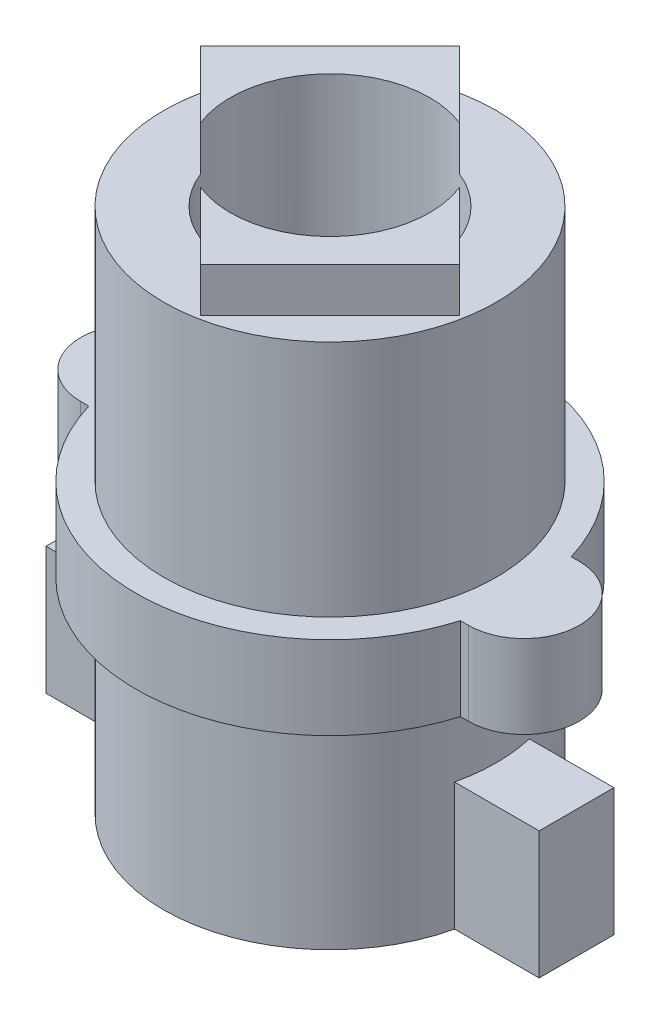
ISO-10303-21;
HEADER;
FILE_DESCRIPTION(('STEP AP214'),'2;1');
FILE_NAME('part.step','',(''),(''),'','','');
FILE_SCHEMA(('AUTOMOTIVE_DESIGN { 1 0 10303 214 1 1 1 1 }'));
ENDSEC;
DATA;
#1=APPLICATION_CONTEXT('core data for automotive mechanical design processes');
#2=APPLICATION_PROTOCOL_DEFINITION('international standard','automotive_design',2000,#1);
#3=PRODUCT_CONTEXT('',#1,'mechanical');
#4=PRODUCT('Part','Part','',(#3));
#5=PRODUCT_RELATED_PRODUCT_CATEGORY('part','',(#4));
#6=PRODUCT_DEFINITION_FORMATION('','',#4);
#7=PRODUCT_DEFINITION_CONTEXT('part definition',#1,'design');
#8=PRODUCT_DEFINITION('design','',#6,#7);
#9=PRODUCT_DEFINITION_SHAPE('','',#8);
#10=(LENGTH_UNIT() NAMED_UNIT(*) SI_UNIT(.MILLI.,.METRE.));
#11=(NAMED_UNIT(*) PLANE_ANGLE_UNIT() SI_UNIT($,.RADIAN.));
#12=(NAMED_UNIT(*) SI_UNIT($,.STERADIAN.) SOLID_ANGLE_UNIT());
#13=UNCERTAINTY_MEASURE_WITH_UNIT(LENGTH_MEASURE(1.E-05),#10,'distance_accuracy_value','');
#14=(GEOMETRIC_REPRESENTATION_CONTEXT(3) GLOBAL_UNCERTAINTY_ASSIGNED_CONTEXT((#13)) GLOBAL_UNIT_ASSIGNED_CONTEXT((#10,
#11,#12)) REPRESENTATION_CONTEXT('',''));
#15=CARTESIAN_POINT('',(0.,0.,0.));
#16=DIRECTION('',(0.,0.,1.));
#17=DIRECTION('',(1.,0.,0.));
#18=AXIS2_PLACEMENT_3D('',#15,#16,#17);
#19=CARTESIAN_POINT('',(0.,19.,0.));
#20=DIRECTION('',(0.,-1.,0.));
#21=DIRECTION('',(0.,0.,-1.));
#22=AXIS2_PLACEMENT_3D('',#19,#20,#21);
#23=PLANE('',#22);
#24=CARTESIAN_POINT('',(0.,19.,0.));
#25=DIRECTION('',(0.,-1.,0.));
#26=DIRECTION('',(0.,0.,-1.));
#27=AXIS2_PLACEMENT_3D('',#24,#25,#26);
#28=CIRCLE('',#27,6.);
#29=CARTESIAN_POINT('',(0.,19.,-6.));
#30=VERTEX_POINT('',#29);
#31=EDGE_CURVE('E246',#30,#30,#28,.T.);
#32=ORIENTED_EDGE('',*,*,#31,.F.);
#33=EDGE_LOOP('',(#32));
#34=FACE_BOUND('',#33,.T.);
#35=DIRECTION('',(-0.707106781186548,0.,-0.707106781186547));
#36=VECTOR('',#35,1.);
#37=CARTESIAN_POINT('',(-1.07798428791888,19.,-5.74771747087486));
#38=LINE('',#37,#36);
#39=CARTESIAN_POINT('',(1.32076699084699,19.,-3.34896619210899));
#40=VERTEX_POINT('',#39);
#41=CARTESIAN_POINT('',(-1.07798428791888,19.,-5.74771747087486));
#42=VERTEX_POINT('',#41);
#43=EDGE_CURVE('E238',#40,#42,#38,.T.);
#44=ORIENTED_EDGE('',*,*,#43,.F.);
#45=CARTESIAN_POINT('',(0.,19.,0.));
#46=DIRECTION('',(0.,-1.,0.));
#47=DIRECTION('',(0.,0.,-1.));
#48=AXIS2_PLACEMENT_3D('',#45,#46,#47);
#49=CIRCLE('',#48,3.6);
#50=CARTESIAN_POINT('',(3.34896619210901,19.,-1.32076699084695));
#51=VERTEX_POINT('',#50);
#52=EDGE_CURVE('E205',#40,#51,#49,.T.);
#53=ORIENTED_EDGE('',*,*,#52,.T.);
#54=DIRECTION('',(-0.707106781186548,0.,-0.707106781186547));
#55=VECTOR('',#54,1.);
#56=CARTESIAN_POINT('',(3.32304831818618,19.,-1.34668486476977));
#57=LINE('',#56,#55);
#58=CARTESIAN_POINT('',(5.74771747087485,19.,1.07798428791889));
#59=VERTEX_POINT('',#58);
#60=EDGE_CURVE('E62',#59,#51,#57,.T.);
#61=ORIENTED_EDGE('',*,*,#60,.F.);
#62=DIRECTION('',(0.707106781186547,0.,-0.707106781186548));
#63=VECTOR('',#62,1.);
#64=CARTESIAN_POINT('',(1.07798428791888,19.,5.74771747087486));
#65=LINE('',#64,#63);
#66=CARTESIAN_POINT('',(1.07798428791888,19.,5.74771747087486));
#67=VERTEX_POINT('',#66);
#68=EDGE_CURVE('E304',#67,#59,#65,.T.);
#69=ORIENTED_EDGE('',*,*,#68,.F.);
#70=DIRECTION('',(0.707106781186546,0.,0.707106781186549));
#71=VECTOR('',#70,1.);
#72=CARTESIAN_POINT('',(-1.34668486476979,19.,3.32304831818618));
#73=LINE('',#72,#71);
#74=CARTESIAN_POINT('',(-1.32076699084696,19.,3.348966192109));
#75=VERTEX_POINT('',#74);
#76=EDGE_CURVE('E325',#75,#67,#73,.T.);
#77=ORIENTED_EDGE('',*,*,#76,.F.);
#78=CARTESIAN_POINT('',(-3.348966192109,19.,1.32076699084696));
#79=VERTEX_POINT('',#78);
#80=EDGE_CURVE('E343',#75,#79,#49,.T.);
#81=ORIENTED_EDGE('',*,*,#80,.T.);
#82=DIRECTION('',(0.707106781186546,0.,0.707106781186549));
#83=VECTOR('',#82,1.);
#84=CARTESIAN_POINT('',(-5.74771747087485,19.,-1.0779842879189));
#85=LINE('',#84,#83);
#86=CARTESIAN_POINT('',(-5.74771747087485,19.,-1.0779842879189));
#87=VERTEX_POINT('',#86);
#88=EDGE_CURVE('E226',#87,#79,#85,.T.);
#89=ORIENTED_EDGE('',*,*,#88,.F.);
#90=DIRECTION('',(-0.707106781186549,0.,0.707106781186546));
#91=VECTOR('',#90,1.);
#92=CARTESIAN_POINT('',(-5.74771747087485,19.,-1.0779842879189));
#93=LINE('',#92,#91);
#94=EDGE_CURVE('E230',#42,#87,#93,.T.);
#95=ORIENTED_EDGE('',*,*,#94,.F.);
#96=EDGE_LOOP('',(#44,#53,#61,#69,#77,#81,#89,#95));
#97=FACE_BOUND('',#96,.T.);
#98=ADVANCED_FACE('F39',(#34,#97),#23,.F.);
#99=CARTESIAN_POINT('',(0.,19.,0.));
#100=DIRECTION('',(0.,-1.,0.));
#101=DIRECTION('',(0.,0.,-1.));
#102=AXIS2_PLACEMENT_3D('',#99,#100,#101);
#103=CYLINDRICAL_SURFACE('',#102,6.);
#104=CARTESIAN_POINT('',(0.,10.4,0.));
#105=DIRECTION('',(0.,1.,0.));
#106=DIRECTION('',(0.,0.,1.));
#107=AXIS2_PLACEMENT_3D('',#104,#105,#106);
#108=CIRCLE('',#107,6.);
#109=CARTESIAN_POINT('',(0.,10.4,6.));
#110=VERTEX_POINT('',#109);
#111=EDGE_CURVE('E11',#110,#110,#108,.F.);
#112=ORIENTED_EDGE('',*,*,#111,.F.);
#113=EDGE_LOOP('',(#112));
#114=FACE_BOUND('',#113,.T.);
#115=ORIENTED_EDGE('',*,*,#31,.T.);
#116=EDGE_LOOP('',(#115));
#117=FACE_BOUND('',#116,.T.);
#118=ADVANCED_FACE('F451',(#114,#117),#103,.T.);
#119=CARTESIAN_POINT('',(-1.07798428791888,20.6,-5.74771747087486));
#120=DIRECTION('',(-0.707106781186547,0.,0.707106781186548));
#121=DIRECTION('',(0.707106781186548,0.,0.707106781186547));
#122=AXIS2_PLACEMENT_3D('',#119,#120,#121);
#123=PLANE('',#122);
#124=DIRECTION('',(-0.707106781186548,0.,-0.707106781186547));
#125=VECTOR('',#124,1.);
#126=CARTESIAN_POINT('',(-1.07798428791888,20.6,-5.74771747087486));
#127=LINE('',#126,#125);
#128=CARTESIAN_POINT('',(1.32076699084699,20.6,-3.34896619210899));
#129=VERTEX_POINT('',#128);
#130=CARTESIAN_POINT('',(-1.07798428791888,20.6,-5.74771747087486));
#131=VERTEX_POINT('',#130);
#132=EDGE_CURVE('E214',#129,#131,#127,.T.);
#133=ORIENTED_EDGE('',*,*,#132,.F.);
#134=DIRECTION('',(0.,-1.,0.));
#135=VECTOR('',#134,1.);
#136=CARTESIAN_POINT('',(1.32076699084699,20.6,-3.34896619210899));
#137=LINE('',#136,#135);
#138=EDGE_CURVE('E200',#129,#40,#137,.T.);
#139=ORIENTED_EDGE('',*,*,#138,.T.);
#140=ORIENTED_EDGE('',*,*,#43,.T.);
#141=DIRECTION('',(0.,-1.,0.));
#142=VECTOR('',#141,1.);
#143=CARTESIAN_POINT('',(-1.07798428791888,20.6,-5.74771747087486));
#144=LINE('',#143,#142);
#145=EDGE_CURVE('E223',#131,#42,#144,.T.);
#146=ORIENTED_EDGE('',*,*,#145,.F.);
#147=EDGE_LOOP('',(#133,#139,#140,#146));
#148=FACE_BOUND('',#147,.T.);
#149=ADVANCED_FACE('F221',(#148),#123,.F.);
#150=CARTESIAN_POINT('',(-5.74771747087485,20.6,-1.0779842879189));
#151=DIRECTION('',(0.707106781186546,0.,0.707106781186549));
#152=DIRECTION('',(0.707106781186549,0.,-0.707106781186546));
#153=AXIS2_PLACEMENT_3D('',#150,#151,#152);
#154=PLANE('',#153);
#155=ORIENTED_EDGE('',*,*,#94,.T.);
#156=DIRECTION('',(0.,-1.,0.));
#157=VECTOR('',#156,1.);
#158=CARTESIAN_POINT('',(-5.74771747087485,20.6,-1.0779842879189));
#159=LINE('',#158,#157);
#160=CARTESIAN_POINT('',(-5.74771747087485,20.6,-1.0779842879189));
#161=VERTEX_POINT('',#160);
#162=EDGE_CURVE('E237',#161,#87,#159,.T.);
#163=ORIENTED_EDGE('',*,*,#162,.F.);
#164=DIRECTION('',(-0.707106781186549,0.,0.707106781186546));
#165=VECTOR('',#164,1.);
#166=CARTESIAN_POINT('',(-5.74771747087485,20.6,-1.0779842879189));
#167=LINE('',#166,#165);
#168=EDGE_CURVE('E225',#131,#161,#167,.T.);
#169=ORIENTED_EDGE('',*,*,#168,.F.);
#170=ORIENTED_EDGE('',*,*,#145,.T.);
#171=EDGE_LOOP('',(#155,#163,#169,#170));
#172=FACE_BOUND('',#171,.T.);
#173=ADVANCED_FACE('F569',(#172),#154,.F.);
#174=CARTESIAN_POINT('',(-5.74771747087485,20.6,-1.0779842879189));
#175=DIRECTION('',(0.707106781186549,0.,-0.707106781186546));
#176=DIRECTION('',(-0.707106781186546,0.,-0.707106781186549));
#177=AXIS2_PLACEMENT_3D('',#174,#175,#176);
#178=PLANE('',#177);
#179=ORIENTED_EDGE('',*,*,#88,.T.);
#180=DIRECTION('',(0.,-1.,0.));
#181=VECTOR('',#180,1.);
#182=CARTESIAN_POINT('',(-3.348966192109,20.6,1.32076699084696));
#183=LINE('',#182,#181);
#184=CARTESIAN_POINT('',(-3.348966192109,20.6,1.32076699084696));
#185=VERTEX_POINT('',#184);
#186=EDGE_CURVE('E348',#79,#185,#183,.F.);
#187=ORIENTED_EDGE('',*,*,#186,.T.);
#188=DIRECTION('',(0.707106781186546,0.,0.707106781186549));
#189=VECTOR('',#188,1.);
#190=CARTESIAN_POINT('',(-5.74771747087485,20.6,-1.0779842879189));
#191=LINE('',#190,#189);
#192=EDGE_CURVE('E217',#161,#185,#191,.T.);
#193=ORIENTED_EDGE('',*,*,#192,.F.);
#194=ORIENTED_EDGE('',*,*,#162,.T.);
#195=EDGE_LOOP('',(#179,#187,#193,#194));
#196=FACE_BOUND('',#195,.T.);
#197=ADVANCED_FACE('F575',(#196),#178,.F.);
#198=CARTESIAN_POINT('',(0.,20.6,0.));
#199=DIRECTION('',(0.,-1.,0.));
#200=DIRECTION('',(0.,0.,-1.));
#201=AXIS2_PLACEMENT_3D('',#198,#199,#200);
#202=PLANE('',#201);
#203=ORIENTED_EDGE('',*,*,#192,.T.);
#204=CARTESIAN_POINT('',(0.,20.6,0.));
#205=DIRECTION('',(0.,-1.,0.));
#206=DIRECTION('',(0.,0.,-1.));
#207=AXIS2_PLACEMENT_3D('',#204,#205,#206);
#208=CIRCLE('',#207,3.6);
#209=EDGE_CURVE('E203',#185,#129,#208,.T.);
#210=ORIENTED_EDGE('',*,*,#209,.T.);
#211=ORIENTED_EDGE('',*,*,#132,.T.);
#212=ORIENTED_EDGE('',*,*,#168,.T.);
#213=EDGE_LOOP('',(#203,#210,#211,#212));
#214=FACE_BOUND('',#213,.T.);
#215=ADVANCED_FACE('F213',(#214),#202,.F.);
#216=CARTESIAN_POINT('',(1.07798428791888,20.6,5.74771747087486));
#217=DIRECTION('',(-0.707106781186548,0.,-0.707106781186547));
#218=DIRECTION('',(-0.707106781186547,0.,0.707106781186548));
#219=AXIS2_PLACEMENT_3D('',#216,#217,#218);
#220=PLANE('',#219);
#221=ORIENTED_EDGE('',*,*,#68,.T.);
#222=DIRECTION('',(0.,-1.,0.));
#223=VECTOR('',#222,1.);
#224=CARTESIAN_POINT('',(5.74771747087485,20.6,1.07798428791889));
#225=LINE('',#224,#223);
#226=CARTESIAN_POINT('',(5.74771747087485,20.6,1.07798428791889));
#227=VERTEX_POINT('',#226);
#228=EDGE_CURVE('E233',#227,#59,#225,.T.);
#229=ORIENTED_EDGE('',*,*,#228,.F.);
#230=DIRECTION('',(0.707106781186547,0.,-0.707106781186548));
#231=VECTOR('',#230,1.);
#232=CARTESIAN_POINT('',(1.07798428791888,20.6,5.74771747087486));
#233=LINE('',#232,#231);
#234=CARTESIAN_POINT('',(1.07798428791888,20.6,5.74771747087486));
#235=VERTEX_POINT('',#234);
#236=EDGE_CURVE('E321',#235,#227,#233,.T.);
#237=ORIENTED_EDGE('',*,*,#236,.F.);
#238=DIRECTION('',(0.,-1.,0.));
#239=VECTOR('',#238,1.);
#240=CARTESIAN_POINT('',(1.07798428791888,20.6,5.74771747087486));
#241=LINE('',#240,#239);
#242=EDGE_CURVE('E329',#235,#67,#241,.T.);
#243=ORIENTED_EDGE('',*,*,#242,.T.);
#244=EDGE_LOOP('',(#221,#229,#237,#243));
#245=FACE_BOUND('',#244,.T.);
#246=ADVANCED_FACE('F340',(#245),#220,.F.);
#247=CARTESIAN_POINT('',(3.32304831818618,20.6,-1.34668486476977));
#248=DIRECTION('',(-0.707106781186547,0.,0.707106781186548));
#249=DIRECTION('',(0.707106781186548,0.,0.707106781186547));
#250=AXIS2_PLACEMENT_3D('',#247,#248,#249);
#251=PLANE('',#250);
#252=ORIENTED_EDGE('',*,*,#60,.T.);
#253=DIRECTION('',(0.,-1.,0.));
#254=VECTOR('',#253,1.);
#255=CARTESIAN_POINT('',(3.34896619210901,20.6,-1.32076699084695));
#256=LINE('',#255,#254);
#257=CARTESIAN_POINT('',(3.348966192109,20.6,-1.32076699084695));
#258=VERTEX_POINT('',#257);
#259=EDGE_CURVE('E353',#51,#258,#256,.F.);
#260=ORIENTED_EDGE('',*,*,#259,.T.);
#261=DIRECTION('',(-0.707106781186548,0.,-0.707106781186547));
#262=VECTOR('',#261,1.);
#263=CARTESIAN_POINT('',(3.32304831818618,20.6,-1.34668486476977));
#264=LINE('',#263,#262);
#265=EDGE_CURVE('E324',#227,#258,#264,.T.);
#266=ORIENTED_EDGE('',*,*,#265,.F.);
#267=ORIENTED_EDGE('',*,*,#228,.T.);
#268=EDGE_LOOP('',(#252,#260,#266,#267));
#269=FACE_BOUND('',#268,.T.);
#270=ADVANCED_FACE('F338',(#269),#251,.F.);
#271=CARTESIAN_POINT('',(-1.34668486476979,20.6,3.32304831818618));
#272=DIRECTION('',(0.707106781186549,0.,-0.707106781186546));
#273=DIRECTION('',(-0.707106781186546,0.,-0.707106781186549));
#274=AXIS2_PLACEMENT_3D('',#271,#272,#273);
#275=PLANE('',#274);
#276=DIRECTION('',(0.707106781186546,0.,0.707106781186549));
#277=VECTOR('',#276,1.);
#278=CARTESIAN_POINT('',(-1.34668486476979,20.6,3.32304831818618));
#279=LINE('',#278,#277);
#280=CARTESIAN_POINT('',(-1.32076699084696,20.6,3.348966192109));
#281=VERTEX_POINT('',#280);
#282=EDGE_CURVE('E328',#281,#235,#279,.T.);
#283=ORIENTED_EDGE('',*,*,#282,.F.);
#284=DIRECTION('',(0.,-1.,0.));
#285=VECTOR('',#284,1.);
#286=CARTESIAN_POINT('',(-1.32076699084696,20.6,3.348966192109));
#287=LINE('',#286,#285);
#288=EDGE_CURVE('E54',#281,#75,#287,.T.);
#289=ORIENTED_EDGE('',*,*,#288,.T.);
#290=ORIENTED_EDGE('',*,*,#76,.T.);
#291=ORIENTED_EDGE('',*,*,#242,.F.);
#292=EDGE_LOOP('',(#283,#289,#290,#291));
#293=FACE_BOUND('',#292,.T.);
#294=ADVANCED_FACE('F346',(#293),#275,.F.);
#295=CARTESIAN_POINT('',(0.,20.6,0.));
#296=DIRECTION('',(0.,-1.,0.));
#297=DIRECTION('',(0.,0.,-1.));
#298=AXIS2_PLACEMENT_3D('',#295,#296,#297);
#299=PLANE('',#298);
#300=ORIENTED_EDGE('',*,*,#265,.T.);
#301=EDGE_CURVE('E218',#258,#281,#208,.T.);
#302=ORIENTED_EDGE('',*,*,#301,.T.);
#303=ORIENTED_EDGE('',*,*,#282,.T.);
#304=ORIENTED_EDGE('',*,*,#236,.T.);
#305=EDGE_LOOP('',(#300,#302,#303,#304));
#306=FACE_BOUND('',#305,.T.);
#307=ADVANCED_FACE('F607',(#306),#299,.F.);
#308=CARTESIAN_POINT('',(0.,10.4,2.));
#309=DIRECTION('',(0.,0.,-1.));
#310=DIRECTION('',(-1.,0.,0.));
#311=AXIS2_PLACEMENT_3D('',#308,#309,#310);
#312=PLANE('',#311);
#313=DIRECTION('',(1.,0.,0.));
#314=VECTOR('',#313,1.);
#315=CARTESIAN_POINT('',(0.,7.4,2.));
#316=LINE('',#315,#314);
#317=CARTESIAN_POINT('',(-7.,7.4,2.));
#318=VERTEX_POINT('',#317);
#319=CARTESIAN_POINT('',(-6.70820393249937,7.4,2.));
#320=VERTEX_POINT('',#319);
#321=EDGE_CURVE('E209',#318,#320,#316,.T.);
#322=ORIENTED_EDGE('',*,*,#321,.T.);
#323=DIRECTION('',(0.,-1.,0.));
#324=VECTOR('',#323,1.);
#325=CARTESIAN_POINT('',(-6.70820393249937,10.4,2.));
#326=LINE('',#325,#324);
#327=CARTESIAN_POINT('',(-6.70820393249937,10.4,2.));
#328=VERTEX_POINT('',#327);
#329=EDGE_CURVE('E305',#328,#320,#326,.T.);
#330=ORIENTED_EDGE('',*,*,#329,.F.);
#331=DIRECTION('',(1.,0.,0.));
#332=VECTOR('',#331,1.);
#333=CARTESIAN_POINT('',(0.,10.4,2.));
#334=LINE('',#333,#332);
#335=CARTESIAN_POINT('',(-7.,10.4,2.));
#336=VERTEX_POINT('',#335);
#337=EDGE_CURVE('E355',#336,#328,#334,.T.);
#338=ORIENTED_EDGE('',*,*,#337,.F.);
#339=DIRECTION('',(0.,-1.,0.));
#340=VECTOR('',#339,1.);
#341=CARTESIAN_POINT('',(-7.,10.4,2.));
#342=LINE('',#341,#340);
#343=EDGE_CURVE('E375',#336,#318,#342,.T.);
#344=ORIENTED_EDGE('',*,*,#343,.T.);
#345=EDGE_LOOP('',(#322,#330,#338,#344));
#346=FACE_BOUND('',#345,.T.);
#347=ADVANCED_FACE('F432',(#346),#312,.F.);
#348=CARTESIAN_POINT('',(0.,10.4,0.));
#349=DIRECTION('',(0.,-1.,0.));
#350=DIRECTION('',(0.,0.,-1.));
#351=AXIS2_PLACEMENT_3D('',#348,#349,#350);
#352=CYLINDRICAL_SURFACE('',#351,7.);
#353=CARTESIAN_POINT('',(0.,7.4,0.));
#354=DIRECTION('',(0.,1.,0.));
#355=DIRECTION('',(0.,0.,1.));
#356=AXIS2_PLACEMENT_3D('',#353,#354,#355);
#357=CIRCLE('',#356,7.);
#358=CARTESIAN_POINT('',(6.70820393249937,7.4,2.));
#359=VERTEX_POINT('',#358);
#360=EDGE_CURVE('E377',#320,#359,#357,.T.);
#361=ORIENTED_EDGE('',*,*,#360,.T.);
#362=DIRECTION('',(0.,-1.,0.));
#363=VECTOR('',#362,1.);
#364=CARTESIAN_POINT('',(6.70820393249937,10.4,2.));
#365=LINE('',#364,#363);
#366=CARTESIAN_POINT('',(6.70820393249937,10.4,2.));
#367=VERTEX_POINT('',#366);
#368=EDGE_CURVE('E311',#367,#359,#365,.T.);
#369=ORIENTED_EDGE('',*,*,#368,.F.);
#370=CARTESIAN_POINT('',(0.,10.4,0.));
#371=DIRECTION('',(0.,1.,0.));
#372=DIRECTION('',(0.,0.,1.));
#373=AXIS2_PLACEMENT_3D('',#370,#371,#372);
#374=CIRCLE('',#373,7.);
#375=EDGE_CURVE('E358',#328,#367,#374,.T.);
#376=ORIENTED_EDGE('',*,*,#375,.F.);
#377=ORIENTED_EDGE('',*,*,#329,.T.);
#378=EDGE_LOOP('',(#361,#369,#376,#377));
#379=FACE_BOUND('',#378,.T.);
#380=ADVANCED_FACE('F428',(#379),#352,.T.);
#381=CARTESIAN_POINT('',(0.,10.4,2.));
#382=DIRECTION('',(0.,0.,-1.));
#383=DIRECTION('',(-1.,0.,0.));
#384=AXIS2_PLACEMENT_3D('',#381,#382,#383);
#385=PLANE('',#384);
#386=DIRECTION('',(1.,0.,0.));
#387=VECTOR('',#386,1.);
#388=CARTESIAN_POINT('',(0.,7.4,2.));
#389=LINE('',#388,#387);
#390=CARTESIAN_POINT('',(7.,7.4,2.));
#391=VERTEX_POINT('',#390);
#392=EDGE_CURVE('E379',#359,#391,#389,.T.);
#393=ORIENTED_EDGE('',*,*,#392,.T.);
#394=DIRECTION('',(0.,-1.,0.));
#395=VECTOR('',#394,1.);
#396=CARTESIAN_POINT('',(7.,10.4,2.));
#397=LINE('',#396,#395);
#398=CARTESIAN_POINT('',(7.,10.4,2.));
#399=VERTEX_POINT('',#398);
#400=EDGE_CURVE('E317',#399,#391,#397,.T.);
#401=ORIENTED_EDGE('',*,*,#400,.F.);
#402=DIRECTION('',(1.,0.,0.));
#403=VECTOR('',#402,1.);
#404=CARTESIAN_POINT('',(0.,10.4,2.));
#405=LINE('',#404,#403);
#406=EDGE_CURVE('E361',#367,#399,#405,.T.);
#407=ORIENTED_EDGE('',*,*,#406,.F.);
#408=ORIENTED_EDGE('',*,*,#368,.T.);
#409=EDGE_LOOP('',(#393,#401,#407,#408));
#410=FACE_BOUND('',#409,.T.);
#411=ADVANCED_FACE('F427',(#410),#385,.F.);
#412=CARTESIAN_POINT('',(7.,10.4,0.));
#413=DIRECTION('',(0.,-1.,0.));
#414=DIRECTION('',(0.,0.,-1.));
#415=AXIS2_PLACEMENT_3D('',#412,#413,#414);
#416=CYLINDRICAL_SURFACE('',#415,2.);
#417=CARTESIAN_POINT('',(7.,7.4,0.));
#418=DIRECTION('',(0.,1.,0.));
#419=DIRECTION('',(0.,0.,1.));
#420=AXIS2_PLACEMENT_3D('',#417,#418,#419);
#421=CIRCLE('',#420,2.);
#422=CARTESIAN_POINT('',(7.,7.4,-2.));
#423=VERTEX_POINT('',#422);
#424=EDGE_CURVE('E381',#391,#423,#421,.T.);
#425=ORIENTED_EDGE('',*,*,#424,.T.);
#426=DIRECTION('',(0.,-1.,0.));
#427=VECTOR('',#426,1.);
#428=CARTESIAN_POINT('',(7.,10.4,-2.));
#429=LINE('',#428,#427);
#430=CARTESIAN_POINT('',(7.,10.4,-2.));
#431=VERTEX_POINT('',#430);
#432=EDGE_CURVE('E402',#431,#423,#429,.T.);
#433=ORIENTED_EDGE('',*,*,#432,.F.);
#434=CARTESIAN_POINT('',(7.,10.4,0.));
#435=DIRECTION('',(0.,1.,0.));
#436=DIRECTION('',(0.,0.,1.));
#437=AXIS2_PLACEMENT_3D('',#434,#435,#436);
#438=CIRCLE('',#437,2.);
#439=EDGE_CURVE('E363',#399,#431,#438,.T.);
#440=ORIENTED_EDGE('',*,*,#439,.F.);
#441=ORIENTED_EDGE('',*,*,#400,.T.);
#442=EDGE_LOOP('',(#425,#433,#440,#441));
#443=FACE_BOUND('',#442,.T.);
#444=ADVANCED_FACE('F408',(#443),#416,.T.);
#445=CARTESIAN_POINT('',(0.,10.4,-2.));
#446=DIRECTION('',(0.,0.,-1.));
#447=DIRECTION('',(-1.,0.,0.));
#448=AXIS2_PLACEMENT_3D('',#445,#446,#447);
#449=PLANE('',#448);
#450=DIRECTION('',(1.,0.,0.));
#451=VECTOR('',#450,1.);
#452=CARTESIAN_POINT('',(0.,7.4,-2.));
#453=LINE('',#452,#451);
#454=CARTESIAN_POINT('',(6.70820393249937,7.4,-2.));
#455=VERTEX_POINT('',#454);
#456=EDGE_CURVE('E384',#455,#423,#453,.T.);
#457=ORIENTED_EDGE('',*,*,#456,.F.);
#458=DIRECTION('',(0.,-1.,0.));
#459=VECTOR('',#458,1.);
#460=CARTESIAN_POINT('',(6.70820393249937,10.4,-2.));
#461=LINE('',#460,#459);
#462=CARTESIAN_POINT('',(6.70820393249937,10.4,-2.));
#463=VERTEX_POINT('',#462);
#464=EDGE_CURVE('E400',#463,#455,#461,.T.);
#465=ORIENTED_EDGE('',*,*,#464,.F.);
#466=DIRECTION('',(1.,0.,0.));
#467=VECTOR('',#466,1.);
#468=CARTESIAN_POINT('',(0.,10.4,-2.));
#469=LINE('',#468,#467);
#470=EDGE_CURVE('E365',#463,#431,#469,.T.);
#471=ORIENTED_EDGE('',*,*,#470,.T.);
#472=ORIENTED_EDGE('',*,*,#432,.T.);
#473=EDGE_LOOP('',(#457,#465,#471,#472));
#474=FACE_BOUND('',#473,.T.);
#475=ADVANCED_FACE('F419',(#474),#449,.T.);
#476=CARTESIAN_POINT('',(0.,10.4,0.));
#477=DIRECTION('',(0.,-1.,0.));
#478=DIRECTION('',(0.,0.,-1.));
#479=AXIS2_PLACEMENT_3D('',#476,#477,#478);
#480=CYLINDRICAL_SURFACE('',#479,7.);
#481=CARTESIAN_POINT('',(0.,7.4,0.));
#482=DIRECTION('',(0.,1.,0.));
#483=DIRECTION('',(0.,0.,1.));
#484=AXIS2_PLACEMENT_3D('',#481,#482,#483);
#485=CIRCLE('',#484,7.);
#486=CARTESIAN_POINT('',(-6.70820393249937,7.4,-2.));
#487=VERTEX_POINT('',#486);
#488=EDGE_CURVE('E387',#455,#487,#485,.T.);
#489=ORIENTED_EDGE('',*,*,#488,.T.);
#490=DIRECTION('',(0.,-1.,0.));
#491=VECTOR('',#490,1.);
#492=CARTESIAN_POINT('',(-6.70820393249937,10.4,-2.));
#493=LINE('',#492,#491);
#494=CARTESIAN_POINT('',(-6.70820393249937,10.4,-2.));
#495=VERTEX_POINT('',#494);
#496=EDGE_CURVE('E398',#495,#487,#493,.T.);
#497=ORIENTED_EDGE('',*,*,#496,.F.);
#498=CARTESIAN_POINT('',(0.,10.4,0.));
#499=DIRECTION('',(0.,1.,0.));
#500=DIRECTION('',(0.,0.,1.));
#501=AXIS2_PLACEMENT_3D('',#498,#499,#500);
#502=CIRCLE('',#501,7.);
#503=EDGE_CURVE('E368',#463,#495,#502,.T.);
#504=ORIENTED_EDGE('',*,*,#503,.F.);
#505=ORIENTED_EDGE('',*,*,#464,.T.);
#506=EDGE_LOOP('',(#489,#497,#504,#505));
#507=FACE_BOUND('',#506,.T.);
#508=ADVANCED_FACE('F441',(#507),#480,.T.);
#509=CARTESIAN_POINT('',(0.,10.4,-2.));
#510=DIRECTION('',(0.,0.,-1.));
#511=DIRECTION('',(-1.,0.,0.));
#512=AXIS2_PLACEMENT_3D('',#509,#510,#511);
#513=PLANE('',#512);
#514=DIRECTION('',(1.,0.,0.));
#515=VECTOR('',#514,1.);
#516=CARTESIAN_POINT('',(0.,7.4,-2.));
#517=LINE('',#516,#515);
#518=CARTESIAN_POINT('',(-7.,7.4,-2.));
#519=VERTEX_POINT('',#518);
#520=EDGE_CURVE('E390',#519,#487,#517,.T.);
#521=ORIENTED_EDGE('',*,*,#520,.F.);
#522=DIRECTION('',(0.,-1.,0.));
#523=VECTOR('',#522,1.);
#524=CARTESIAN_POINT('',(-7.,10.4,-2.));
#525=LINE('',#524,#523);
#526=CARTESIAN_POINT('',(-7.,10.4,-2.));
#527=VERTEX_POINT('',#526);
#528=EDGE_CURVE('E396',#527,#519,#525,.T.);
#529=ORIENTED_EDGE('',*,*,#528,.F.);
#530=DIRECTION('',(1.,0.,0.));
#531=VECTOR('',#530,1.);
#532=CARTESIAN_POINT('',(0.,10.4,-2.));
#533=LINE('',#532,#531);
#534=EDGE_CURVE('E370',#527,#495,#533,.T.);
#535=ORIENTED_EDGE('',*,*,#534,.T.);
#536=ORIENTED_EDGE('',*,*,#496,.T.);
#537=EDGE_LOOP('',(#521,#529,#535,#536));
#538=FACE_BOUND('',#537,.T.);
#539=ADVANCED_FACE('F439',(#538),#513,.T.);
#540=CARTESIAN_POINT('',(-7.,10.4,0.));
#541=DIRECTION('',(0.,-1.,0.));
#542=DIRECTION('',(0.,0.,-1.));
#543=AXIS2_PLACEMENT_3D('',#540,#541,#542);
#544=CYLINDRICAL_SURFACE('',#543,2.);
#545=CARTESIAN_POINT('',(-7.,7.4,0.));
#546=DIRECTION('',(0.,1.,0.));
#547=DIRECTION('',(0.,0.,1.));
#548=AXIS2_PLACEMENT_3D('',#545,#546,#547);
#549=CIRCLE('',#548,2.);
#550=EDGE_CURVE('E359',#519,#318,#549,.T.);
#551=ORIENTED_EDGE('',*,*,#550,.T.);
#552=ORIENTED_EDGE('',*,*,#343,.F.);
#553=CARTESIAN_POINT('',(-7.,10.4,0.));
#554=DIRECTION('',(0.,1.,0.));
#555=DIRECTION('',(0.,0.,1.));
#556=AXIS2_PLACEMENT_3D('',#553,#554,#555);
#557=CIRCLE('',#556,2.);
#558=EDGE_CURVE('E373',#527,#336,#557,.T.);
#559=ORIENTED_EDGE('',*,*,#558,.F.);
#560=ORIENTED_EDGE('',*,*,#528,.T.);
#561=EDGE_LOOP('',(#551,#552,#559,#560));
#562=FACE_BOUND('',#561,.T.);
#563=ADVANCED_FACE('F437',(#562),#544,.T.);
#564=CARTESIAN_POINT('',(0.,10.4,0.));
#565=DIRECTION('',(0.,1.,0.));
#566=DIRECTION('',(0.,0.,1.));
#567=AXIS2_PLACEMENT_3D('',#564,#565,#566);
#568=PLANE('',#567);
#569=ORIENTED_EDGE('',*,*,#111,.T.);
#570=EDGE_LOOP('',(#569));
#571=FACE_BOUND('',#570,.T.);
#572=ORIENTED_EDGE('',*,*,#337,.T.);
#573=ORIENTED_EDGE('',*,*,#375,.T.);
#574=ORIENTED_EDGE('',*,*,#406,.T.);
#575=ORIENTED_EDGE('',*,*,#439,.T.);
#576=ORIENTED_EDGE('',*,*,#470,.F.);
#577=ORIENTED_EDGE('',*,*,#503,.T.);
#578=ORIENTED_EDGE('',*,*,#534,.F.);
#579=ORIENTED_EDGE('',*,*,#558,.T.);
#580=EDGE_LOOP('',(#572,#573,#574,#575,#576,#577,#578,#579));
#581=FACE_BOUND('',#580,.T.);
#582=ADVANCED_FACE('F423',(#571,#581),#568,.T.);
#583=CARTESIAN_POINT('',(0.,7.4,0.));
#584=DIRECTION('',(0.,1.,0.));
#585=DIRECTION('',(0.,0.,1.));
#586=AXIS2_PLACEMENT_3D('',#583,#584,#585);
#587=PLANE('',#586);
#588=CARTESIAN_POINT('',(0.,7.4,0.));
#589=DIRECTION('',(0.,1.,0.));
#590=DIRECTION('',(0.,0.,1.));
#591=AXIS2_PLACEMENT_3D('',#588,#589,#590);
#592=CIRCLE('',#591,6.);
#593=CARTESIAN_POINT('',(0.,7.4,6.));
#594=VERTEX_POINT('',#593);
#595=EDGE_CURVE('E302',#594,#594,#592,.F.);
#596=ORIENTED_EDGE('',*,*,#595,.F.);
#597=EDGE_LOOP('',(#596));
#598=FACE_BOUND('',#597,.T.);
#599=ORIENTED_EDGE('',*,*,#321,.F.);
#600=ORIENTED_EDGE('',*,*,#550,.F.);
#601=ORIENTED_EDGE('',*,*,#520,.T.);
#602=ORIENTED_EDGE('',*,*,#488,.F.);
#603=ORIENTED_EDGE('',*,*,#456,.T.);
#604=ORIENTED_EDGE('',*,*,#424,.F.);
#605=ORIENTED_EDGE('',*,*,#392,.F.);
#606=ORIENTED_EDGE('',*,*,#360,.F.);
#607=EDGE_LOOP('',(#599,#600,#601,#602,#603,#604,#605,#606));
#608=FACE_BOUND('',#607,.T.);
#609=ADVANCED_FACE('F415',(#598,#608),#587,.F.);
#610=CARTESIAN_POINT('',(-8.9,4.6,-1.35));
#611=DIRECTION('',(1.,0.,0.));
#612=DIRECTION('',(0.,0.,-1.));
#613=AXIS2_PLACEMENT_3D('',#610,#611,#612);
#614=PLANE('',#613);
#615=DIRECTION('',(0.,0.,1.));
#616=VECTOR('',#615,1.);
#617=CARTESIAN_POINT('',(-8.9,0.,-1.35));
#618=LINE('',#617,#616);
#619=CARTESIAN_POINT('',(-8.9,0.,-1.35));
#620=VERTEX_POINT('',#619);
#621=CARTESIAN_POINT('',(-8.9,0.,1.35));
#622=VERTEX_POINT('',#621);
#623=EDGE_CURVE('E267',#620,#622,#618,.T.);
#624=ORIENTED_EDGE('',*,*,#623,.T.);
#625=DIRECTION('',(0.,-1.,0.));
#626=VECTOR('',#625,1.);
#627=CARTESIAN_POINT('',(-8.9,4.6,1.35));
#628=LINE('',#627,#626);
#629=CARTESIAN_POINT('',(-8.9,4.6,1.35));
#630=VERTEX_POINT('',#629);
#631=EDGE_CURVE('E47',#630,#622,#628,.T.);
#632=ORIENTED_EDGE('',*,*,#631,.F.);
#633=DIRECTION('',(0.,0.,1.));
#634=VECTOR('',#633,1.);
#635=CARTESIAN_POINT('',(-8.9,4.6,-1.35));
#636=LINE('',#635,#634);
#637=CARTESIAN_POINT('',(-8.9,4.6,-1.35));
#638=VERTEX_POINT('',#637);
#639=EDGE_CURVE('E268',#638,#630,#636,.T.);
#640=ORIENTED_EDGE('',*,*,#639,.F.);
#641=DIRECTION('',(0.,-1.,0.));
#642=VECTOR('',#641,1.);
#643=CARTESIAN_POINT('',(-8.9,4.6,-1.35));
#644=LINE('',#643,#642);
#645=EDGE_CURVE('E282',#638,#620,#644,.T.);
#646=ORIENTED_EDGE('',*,*,#645,.T.);
#647=EDGE_LOOP('',(#624,#632,#640,#646));
#648=FACE_BOUND('',#647,.T.);
#649=ADVANCED_FACE('F41',(#648),#614,.F.);
#650=CARTESIAN_POINT('',(8.9,4.6,-1.35));
#651=DIRECTION('',(1.,0.,0.));
#652=DIRECTION('',(0.,0.,-1.));
#653=AXIS2_PLACEMENT_3D('',#650,#651,#652);
#654=PLANE('',#653);
#655=DIRECTION('',(0.,0.,1.));
#656=VECTOR('',#655,1.);
#657=CARTESIAN_POINT('',(8.9,0.,-1.35));
#658=LINE('',#657,#656);
#659=CARTESIAN_POINT('',(8.9,0.,-1.35));
#660=VERTEX_POINT('',#659);
#661=CARTESIAN_POINT('',(8.9,0.,1.35));
#662=VERTEX_POINT('',#661);
#663=EDGE_CURVE('E288',#660,#662,#658,.T.);
#664=ORIENTED_EDGE('',*,*,#663,.F.);
#665=DIRECTION('',(0.,-1.,0.));
#666=VECTOR('',#665,1.);
#667=CARTESIAN_POINT('',(8.9,4.6,-1.35));
#668=LINE('',#667,#666);
#669=CARTESIAN_POINT('',(8.9,4.6,-1.35));
#670=VERTEX_POINT('',#669);
#671=EDGE_CURVE('E295',#670,#660,#668,.T.);
#672=ORIENTED_EDGE('',*,*,#671,.F.);
#673=DIRECTION('',(0.,0.,1.));
#674=VECTOR('',#673,1.);
#675=CARTESIAN_POINT('',(8.9,4.6,-1.35));
#676=LINE('',#675,#674);
#677=CARTESIAN_POINT('',(8.9,4.6,1.35));
#678=VERTEX_POINT('',#677);
#679=EDGE_CURVE('E275',#670,#678,#676,.T.);
#680=ORIENTED_EDGE('',*,*,#679,.T.);
#681=DIRECTION('',(0.,-1.,0.));
#682=VECTOR('',#681,1.);
#683=CARTESIAN_POINT('',(8.9,4.6,1.35));
#684=LINE('',#683,#682);
#685=EDGE_CURVE('E298',#678,#662,#684,.T.);
#686=ORIENTED_EDGE('',*,*,#685,.T.);
#687=EDGE_LOOP('',(#664,#672,#680,#686));
#688=FACE_BOUND('',#687,.T.);
#689=ADVANCED_FACE('F479',(#688),#654,.T.);
#690=CARTESIAN_POINT('',(-8.9,4.6,1.35));
#691=DIRECTION('',(0.,0.,-1.));
#692=DIRECTION('',(-1.,0.,0.));
#693=AXIS2_PLACEMENT_3D('',#690,#691,#692);
#694=PLANE('',#693);
#695=DIRECTION('',(1.,0.,0.));
#696=VECTOR('',#695,1.);
#697=CARTESIAN_POINT('',(-8.9,0.,1.35));
#698=LINE('',#697,#696);
#699=CARTESIAN_POINT('',(-5.84615258097152,0.,1.35));
#700=VERTEX_POINT('',#699);
#701=EDGE_CURVE('E286',#622,#700,#698,.T.);
#702=ORIENTED_EDGE('',*,*,#701,.T.);
#703=DIRECTION('',(0.,-1.,0.));
#704=VECTOR('',#703,1.);
#705=CARTESIAN_POINT('',(-5.84615258097152,19.,1.35));
#706=LINE('',#705,#704);
#707=CARTESIAN_POINT('',(-5.84615258097152,4.6,1.35));
#708=VERTEX_POINT('',#707);
#709=EDGE_CURVE('E259',#700,#708,#706,.F.);
#710=ORIENTED_EDGE('',*,*,#709,.T.);
#711=DIRECTION('',(1.,0.,0.));
#712=VECTOR('',#711,1.);
#713=CARTESIAN_POINT('',(-8.9,4.6,1.35));
#714=LINE('',#713,#712);
#715=EDGE_CURVE('E273',#630,#708,#714,.T.);
#716=ORIENTED_EDGE('',*,*,#715,.F.);
#717=ORIENTED_EDGE('',*,*,#631,.T.);
#718=EDGE_LOOP('',(#702,#710,#716,#717));
#719=FACE_BOUND('',#718,.T.);
#720=ADVANCED_FACE('F468',(#719),#694,.F.);
#721=CARTESIAN_POINT('',(0.,4.6,0.));
#722=DIRECTION('',(0.,1.,0.));
#723=DIRECTION('',(0.,0.,1.));
#724=AXIS2_PLACEMENT_3D('',#721,#722,#723);
#725=PLANE('',#724);
#726=CARTESIAN_POINT('',(0.,4.6,0.));
#727=DIRECTION('',(0.,1.,0.));
#728=DIRECTION('',(0.,0.,1.));
#729=AXIS2_PLACEMENT_3D('',#726,#727,#728);
#730=CIRCLE('',#729,6.);
#731=CARTESIAN_POINT('',(-5.84615258097152,4.6,-1.35));
#732=VERTEX_POINT('',#731);
#733=EDGE_CURVE('E249',#732,#708,#730,.T.);
#734=ORIENTED_EDGE('',*,*,#733,.F.);
#735=DIRECTION('',(1.,0.,0.));
#736=VECTOR('',#735,1.);
#737=CARTESIAN_POINT('',(-8.9,4.6,-1.35));
#738=LINE('',#737,#736);
#739=EDGE_CURVE('E279',#638,#732,#738,.T.);
#740=ORIENTED_EDGE('',*,*,#739,.F.);
#741=ORIENTED_EDGE('',*,*,#639,.T.);
#742=ORIENTED_EDGE('',*,*,#715,.T.);
#743=EDGE_LOOP('',(#734,#740,#741,#742));
#744=FACE_BOUND('',#743,.T.);
#745=ADVANCED_FACE('F464',(#744),#725,.T.);
#746=CARTESIAN_POINT('',(-8.9,4.6,-1.35));
#747=DIRECTION('',(0.,0.,-1.));
#748=DIRECTION('',(-1.,0.,0.));
#749=AXIS2_PLACEMENT_3D('',#746,#747,#748);
#750=PLANE('',#749);
#751=DIRECTION('',(0.,-1.,0.));
#752=VECTOR('',#751,1.);
#753=CARTESIAN_POINT('',(-5.84615258097152,19.,-1.35));
#754=LINE('',#753,#752);
#755=CARTESIAN_POINT('',(-5.84615258097152,0.,-1.35));
#756=VERTEX_POINT('',#755);
#757=EDGE_CURVE('E255',#756,#732,#754,.F.);
#758=ORIENTED_EDGE('',*,*,#757,.F.);
#759=DIRECTION('',(1.,0.,0.));
#760=VECTOR('',#759,1.);
#761=CARTESIAN_POINT('',(-8.9,0.,-1.35));
#762=LINE('',#761,#760);
#763=EDGE_CURVE('E272',#620,#756,#762,.T.);
#764=ORIENTED_EDGE('',*,*,#763,.F.);
#765=ORIENTED_EDGE('',*,*,#645,.F.);
#766=ORIENTED_EDGE('',*,*,#739,.T.);
#767=EDGE_LOOP('',(#758,#764,#765,#766));
#768=FACE_BOUND('',#767,.T.);
#769=ADVANCED_FACE('F467',(#768),#750,.T.);
#770=CARTESIAN_POINT('',(0.,0.,0.));
#771=DIRECTION('',(0.,1.,0.));
#772=DIRECTION('',(0.,0.,1.));
#773=AXIS2_PLACEMENT_3D('',#770,#771,#772);
#774=PLANE('',#773);
#775=CARTESIAN_POINT('',(0.,0.,0.));
#776=DIRECTION('',(0.,-1.,0.));
#777=DIRECTION('',(0.,0.,-1.));
#778=AXIS2_PLACEMENT_3D('',#775,#776,#777);
#779=CIRCLE('',#778,3.6);
#780=CARTESIAN_POINT('',(0.,0.,-3.6));
#781=VERTEX_POINT('',#780);
#782=EDGE_CURVE('E219',#781,#781,#779,.T.);
#783=ORIENTED_EDGE('',*,*,#782,.F.);
#784=EDGE_LOOP('',(#783));
#785=FACE_BOUND('',#784,.T.);
#786=ORIENTED_EDGE('',*,*,#763,.T.);
#787=CARTESIAN_POINT('',(0.,0.,0.));
#788=DIRECTION('',(0.,-1.,0.));
#789=DIRECTION('',(0.,0.,-1.));
#790=AXIS2_PLACEMENT_3D('',#787,#788,#789);
#791=CIRCLE('',#790,6.);
#792=CARTESIAN_POINT('',(5.84615258097152,0.,-1.35));
#793=VERTEX_POINT('',#792);
#794=EDGE_CURVE('E245',#756,#793,#791,.T.);
#795=ORIENTED_EDGE('',*,*,#794,.T.);
#796=EDGE_CURVE('E291',#793,#660,#762,.T.);
#797=ORIENTED_EDGE('',*,*,#796,.T.);
#798=ORIENTED_EDGE('',*,*,#663,.T.);
#799=CARTESIAN_POINT('',(5.84615258097152,0.,1.35));
#800=VERTEX_POINT('',#799);
#801=EDGE_CURVE('E285',#800,#662,#698,.T.);
#802=ORIENTED_EDGE('',*,*,#801,.F.);
#803=EDGE_CURVE('E250',#800,#700,#791,.T.);
#804=ORIENTED_EDGE('',*,*,#803,.T.);
#805=ORIENTED_EDGE('',*,*,#701,.F.);
#806=ORIENTED_EDGE('',*,*,#623,.F.);
#807=EDGE_LOOP('',(#786,#795,#797,#798,#802,#804,#805,#806));
#808=FACE_BOUND('',#807,.T.);
#809=ADVANCED_FACE('F471',(#785,#808),#774,.F.);
#810=DIRECTION('',(0.,-1.,0.));
#811=VECTOR('',#810,1.);
#812=CARTESIAN_POINT('',(5.84615258097152,19.,-1.35));
#813=LINE('',#812,#811);
#814=CARTESIAN_POINT('',(5.84615258097152,4.6,-1.35));
#815=VERTEX_POINT('',#814);
#816=EDGE_CURVE('E262',#815,#793,#813,.T.);
#817=ORIENTED_EDGE('',*,*,#816,.F.);
#818=EDGE_CURVE('E278',#815,#670,#738,.T.);
#819=ORIENTED_EDGE('',*,*,#818,.T.);
#820=ORIENTED_EDGE('',*,*,#671,.T.);
#821=ORIENTED_EDGE('',*,*,#796,.F.);
#822=EDGE_LOOP('',(#817,#819,#820,#821));
#823=FACE_BOUND('',#822,.T.);
#824=ADVANCED_FACE('F474',(#823),#750,.T.);
#825=CARTESIAN_POINT('',(5.84615258097152,4.6,1.35));
#826=VERTEX_POINT('',#825);
#827=EDGE_CURVE('E256',#826,#815,#730,.T.);
#828=ORIENTED_EDGE('',*,*,#827,.F.);
#829=EDGE_CURVE('E271',#826,#678,#714,.T.);
#830=ORIENTED_EDGE('',*,*,#829,.T.);
#831=ORIENTED_EDGE('',*,*,#679,.F.);
#832=ORIENTED_EDGE('',*,*,#818,.F.);
#833=EDGE_LOOP('',(#828,#830,#831,#832));
#834=FACE_BOUND('',#833,.T.);
#835=ADVANCED_FACE('F470',(#834),#725,.T.);
#836=ORIENTED_EDGE('',*,*,#829,.F.);
#837=DIRECTION('',(0.,-1.,0.));
#838=VECTOR('',#837,1.);
#839=CARTESIAN_POINT('',(5.84615258097152,19.,1.35));
#840=LINE('',#839,#838);
#841=EDGE_CURVE('E265',#826,#800,#840,.T.);
#842=ORIENTED_EDGE('',*,*,#841,.T.);
#843=ORIENTED_EDGE('',*,*,#801,.T.);
#844=ORIENTED_EDGE('',*,*,#685,.F.);
#845=EDGE_LOOP('',(#836,#842,#843,#844));
#846=FACE_BOUND('',#845,.T.);
#847=ADVANCED_FACE('F484',(#846),#694,.F.);
#848=ORIENTED_EDGE('',*,*,#841,.F.);
#849=ORIENTED_EDGE('',*,*,#827,.T.);
#850=ORIENTED_EDGE('',*,*,#816,.T.);
#851=ORIENTED_EDGE('',*,*,#794,.F.);
#852=ORIENTED_EDGE('',*,*,#757,.T.);
#853=ORIENTED_EDGE('',*,*,#733,.T.);
#854=ORIENTED_EDGE('',*,*,#709,.F.);
#855=ORIENTED_EDGE('',*,*,#803,.F.);
#856=EDGE_LOOP('',(#848,#849,#850,#851,#852,#853,#854,#855));
#857=FACE_BOUND('',#856,.T.);
#858=ORIENTED_EDGE('',*,*,#595,.T.);
#859=EDGE_LOOP('',(#858));
#860=FACE_BOUND('',#859,.T.);
#861=ADVANCED_FACE('F459',(#857,#860),#103,.T.);
#862=CARTESIAN_POINT('',(0.,20.6,0.));
#863=DIRECTION('',(0.,-1.,0.));
#864=DIRECTION('',(0.,0.,-1.));
#865=AXIS2_PLACEMENT_3D('',#862,#863,#864);
#866=CYLINDRICAL_SURFACE('',#865,3.6);
#867=ORIENTED_EDGE('',*,*,#782,.T.);
#868=EDGE_LOOP('',(#867));
#869=FACE_BOUND('',#868,.T.);
#870=ORIENTED_EDGE('',*,*,#209,.F.);
#871=ORIENTED_EDGE('',*,*,#186,.F.);
#872=ORIENTED_EDGE('',*,*,#80,.F.);
#873=ORIENTED_EDGE('',*,*,#288,.F.);
#874=ORIENTED_EDGE('',*,*,#301,.F.);
#875=ORIENTED_EDGE('',*,*,#259,.F.);
#876=ORIENTED_EDGE('',*,*,#52,.F.);
#877=ORIENTED_EDGE('',*,*,#138,.F.);
#878=EDGE_LOOP('',(#870,#871,#872,#873,#874,#875,#876,#877));
#879=FACE_BOUND('',#878,.T.);
#880=ADVANCED_FACE('F202',(#869,#879),#866,.F.);
#881=CLOSED_SHELL('',(#98,#118,#149,#173,#197,#215,#246,#270,#294,#307,#347,#380,#411,#444,#475,
#508,#539,#563,#582,#609,#649,#689,#720,#745,#769,#809,#824,#835,#847,#861,#880));
#882=MANIFOLD_SOLID_BREP('B2',#881);
#883=ADVANCED_BREP_SHAPE_REPRESENTATION('',(#18,#882),#14);
#884=SHAPE_DEFINITION_REPRESENTATION(#9,#883);
ENDSEC;
END-ISO-10303-21;
